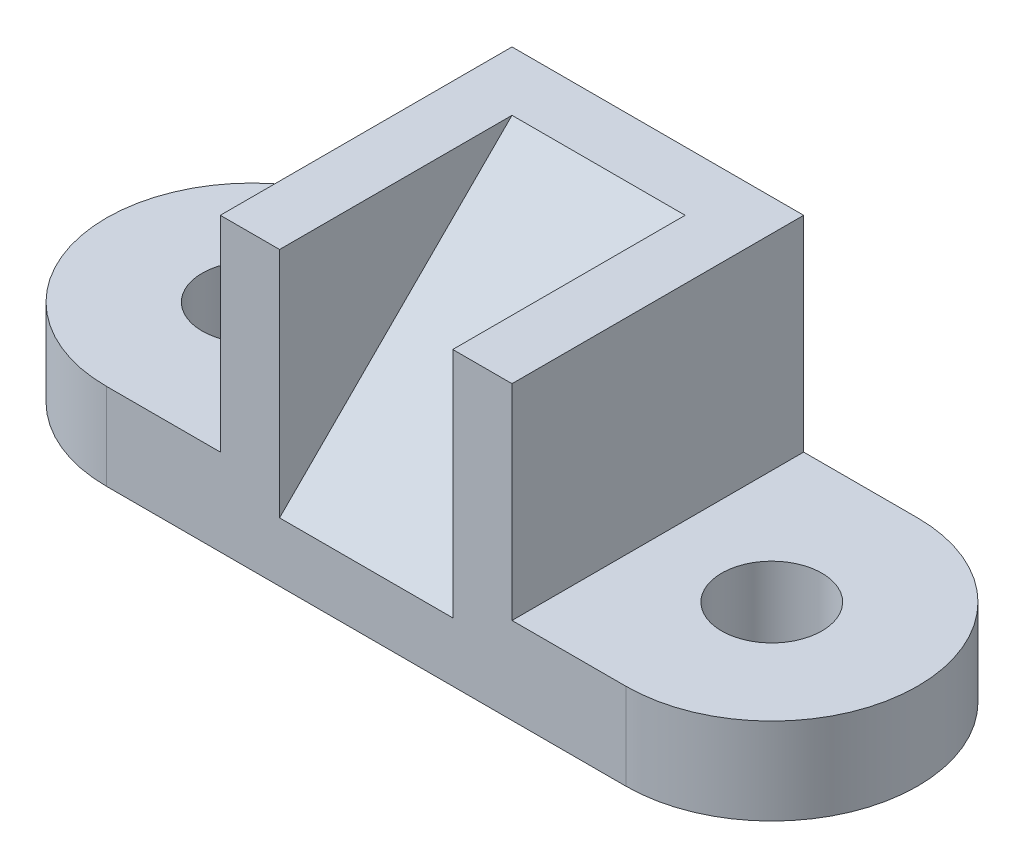
ISO-10303-21;
HEADER;
FILE_DESCRIPTION(('STEP AP214'),'2;1');
FILE_NAME('part.step','',(''),(''),'','','');
FILE_SCHEMA(('AUTOMOTIVE_DESIGN { 1 0 10303 214 1 1 1 1 }'));
ENDSEC;
DATA;
#1=APPLICATION_CONTEXT('core data for automotive mechanical design processes');
#2=APPLICATION_PROTOCOL_DEFINITION('international standard','automotive_design',2000,#1);
#3=PRODUCT_CONTEXT('',#1,'mechanical');
#4=PRODUCT('Part','Part','',(#3));
#5=PRODUCT_RELATED_PRODUCT_CATEGORY('part','',(#4));
#6=PRODUCT_DEFINITION_FORMATION('','',#4);
#7=PRODUCT_DEFINITION_CONTEXT('part definition',#1,'design');
#8=PRODUCT_DEFINITION('design','',#6,#7);
#9=PRODUCT_DEFINITION_SHAPE('','',#8);
#10=(LENGTH_UNIT() NAMED_UNIT(*) SI_UNIT(.MILLI.,.METRE.));
#11=(NAMED_UNIT(*) PLANE_ANGLE_UNIT() SI_UNIT($,.RADIAN.));
#12=(NAMED_UNIT(*) SI_UNIT($,.STERADIAN.) SOLID_ANGLE_UNIT());
#13=UNCERTAINTY_MEASURE_WITH_UNIT(LENGTH_MEASURE(1.E-05),#10,'distance_accuracy_value','');
#14=(GEOMETRIC_REPRESENTATION_CONTEXT(3) GLOBAL_UNCERTAINTY_ASSIGNED_CONTEXT((#13)) GLOBAL_UNIT_ASSIGNED_CONTEXT((#10,
#11,#12)) REPRESENTATION_CONTEXT('',''));
#15=CARTESIAN_POINT('',(0.,0.,0.));
#16=DIRECTION('',(0.,0.,1.));
#17=DIRECTION('',(1.,0.,0.));
#18=AXIS2_PLACEMENT_3D('',#15,#16,#17);
#19=CARTESIAN_POINT('',(19.,13.,32.));
#20=DIRECTION('',(1.,0.,0.));
#21=DIRECTION('',(0.,0.,-1.));
#22=AXIS2_PLACEMENT_3D('',#19,#20,#21);
#23=PLANE('',#22);
#24=DIRECTION('',(0.,-0.707106781186547,0.707106781186548));
#25=VECTOR('',#24,1.);
#26=CARTESIAN_POINT('',(19.,13.,32.));
#27=LINE('',#26,#25);
#28=CARTESIAN_POINT('',(19.,64.,-19.));
#29=VERTEX_POINT('',#28);
#30=CARTESIAN_POINT('',(19.,13.,32.));
#31=VERTEX_POINT('',#30);
#32=EDGE_CURVE('E134',#29,#31,#27,.T.);
#33=ORIENTED_EDGE('',*,*,#32,.T.);
#34=DIRECTION('',(0.,1.,0.));
#35=VECTOR('',#34,1.);
#36=CARTESIAN_POINT('',(19.,13.,32.));
#37=LINE('',#36,#35);
#38=CARTESIAN_POINT('',(19.,64.,32.));
#39=VERTEX_POINT('',#38);
#40=EDGE_CURVE('E123',#31,#39,#37,.T.);
#41=ORIENTED_EDGE('',*,*,#40,.T.);
#42=DIRECTION('',(0.,0.,-1.));
#43=VECTOR('',#42,1.);
#44=CARTESIAN_POINT('',(19.,64.,32.));
#45=LINE('',#44,#43);
#46=EDGE_CURVE('E54',#39,#29,#45,.T.);
#47=ORIENTED_EDGE('',*,*,#46,.T.);
#48=EDGE_LOOP('',(#33,#41,#47));
#49=FACE_BOUND('',#48,.T.);
#50=ADVANCED_FACE('F39',(#49),#23,.F.);
#51=CARTESIAN_POINT('',(-19.,13.,-19.));
#52=DIRECTION('',(-1.,0.,0.));
#53=DIRECTION('',(0.,0.,1.));
#54=AXIS2_PLACEMENT_3D('',#51,#52,#53);
#55=PLANE('',#54);
#56=DIRECTION('',(0.,-0.707106781186547,0.707106781186548));
#57=VECTOR('',#56,1.);
#58=CARTESIAN_POINT('',(-19.,13.,32.));
#59=LINE('',#58,#57);
#60=CARTESIAN_POINT('',(-19.,64.,-19.));
#61=VERTEX_POINT('',#60);
#62=CARTESIAN_POINT('',(-19.,13.,32.));
#63=VERTEX_POINT('',#62);
#64=EDGE_CURVE('E137',#61,#63,#59,.T.);
#65=ORIENTED_EDGE('',*,*,#64,.F.);
#66=DIRECTION('',(0.,0.,1.));
#67=VECTOR('',#66,1.);
#68=CARTESIAN_POINT('',(-19.,64.,-19.));
#69=LINE('',#68,#67);
#70=CARTESIAN_POINT('',(-19.,64.,32.));
#71=VERTEX_POINT('',#70);
#72=EDGE_CURVE('E140',#61,#71,#69,.T.);
#73=ORIENTED_EDGE('',*,*,#72,.T.);
#74=DIRECTION('',(0.,1.,0.));
#75=VECTOR('',#74,1.);
#76=CARTESIAN_POINT('',(-19.,13.,32.));
#77=LINE('',#76,#75);
#78=EDGE_CURVE('E131',#63,#71,#77,.T.);
#79=ORIENTED_EDGE('',*,*,#78,.F.);
#80=EDGE_LOOP('',(#65,#73,#79));
#81=FACE_BOUND('',#80,.T.);
#82=ADVANCED_FACE('F243',(#81),#55,.F.);
#83=CARTESIAN_POINT('',(57.,19.,0.));
#84=DIRECTION('',(0.,1.,0.));
#85=DIRECTION('',(0.,0.,1.));
#86=AXIS2_PLACEMENT_3D('',#83,#84,#85);
#87=PLANE('',#86);
#88=DIRECTION('',(0.,0.,-1.));
#89=VECTOR('',#88,1.);
#90=CARTESIAN_POINT('',(32.,19.,-32.));
#91=LINE('',#90,#89);
#92=CARTESIAN_POINT('',(32.,19.,32.));
#93=VERTEX_POINT('',#92);
#94=CARTESIAN_POINT('',(32.,19.,-32.));
#95=VERTEX_POINT('',#94);
#96=EDGE_CURVE('E62',#93,#95,#91,.T.);
#97=ORIENTED_EDGE('',*,*,#96,.F.);
#98=DIRECTION('',(1.,0.,0.));
#99=VECTOR('',#98,1.);
#100=CARTESIAN_POINT('',(-57.,19.,32.));
#101=LINE('',#100,#99);
#102=CARTESIAN_POINT('',(57.,19.,32.));
#103=VERTEX_POINT('',#102);
#104=EDGE_CURVE('E197',#93,#103,#101,.T.);
#105=ORIENTED_EDGE('',*,*,#104,.T.);
#106=CARTESIAN_POINT('',(57.,19.,0.));
#107=DIRECTION('',(0.,1.,0.));
#108=DIRECTION('',(0.,0.,1.));
#109=AXIS2_PLACEMENT_3D('',#106,#107,#108);
#110=CIRCLE('',#109,32.);
#111=CARTESIAN_POINT('',(57.,19.,-32.));
#112=VERTEX_POINT('',#111);
#113=EDGE_CURVE('E188',#103,#112,#110,.T.);
#114=ORIENTED_EDGE('',*,*,#113,.T.);
#115=DIRECTION('',(-1.,0.,0.));
#116=VECTOR('',#115,1.);
#117=CARTESIAN_POINT('',(-57.,19.,-32.));
#118=LINE('',#117,#116);
#119=EDGE_CURVE('E193',#112,#95,#118,.T.);
#120=ORIENTED_EDGE('',*,*,#119,.T.);
#121=EDGE_LOOP('',(#97,#105,#114,#120));
#122=FACE_BOUND('',#121,.T.);
#123=CARTESIAN_POINT('',(57.,19.,0.));
#124=DIRECTION('',(0.,1.,0.));
#125=DIRECTION('',(0.,0.,1.));
#126=AXIS2_PLACEMENT_3D('',#123,#124,#125);
#127=CIRCLE('',#126,11.);
#128=CARTESIAN_POINT('',(57.,19.,11.));
#129=VERTEX_POINT('',#128);
#130=EDGE_CURVE('E176',#129,#129,#127,.T.);
#131=ORIENTED_EDGE('',*,*,#130,.F.);
#132=EDGE_LOOP('',(#131));
#133=FACE_BOUND('',#132,.T.);
#134=ADVANCED_FACE('F231',(#122,#133),#87,.T.);
#135=DIRECTION('',(0.,0.,1.));
#136=VECTOR('',#135,1.);
#137=CARTESIAN_POINT('',(-32.,19.,-32.));
#138=LINE('',#137,#136);
#139=CARTESIAN_POINT('',(-32.,19.,-32.));
#140=VERTEX_POINT('',#139);
#141=CARTESIAN_POINT('',(-32.,19.,32.));
#142=VERTEX_POINT('',#141);
#143=EDGE_CURVE('E153',#140,#142,#138,.T.);
#144=ORIENTED_EDGE('',*,*,#143,.F.);
#145=CARTESIAN_POINT('',(-57.,19.,-32.));
#146=VERTEX_POINT('',#145);
#147=EDGE_CURVE('E191',#140,#146,#118,.T.);
#148=ORIENTED_EDGE('',*,*,#147,.T.);
#149=CARTESIAN_POINT('',(-57.,19.,0.));
#150=DIRECTION('',(0.,1.,0.));
#151=DIRECTION('',(0.,0.,1.));
#152=AXIS2_PLACEMENT_3D('',#149,#150,#151);
#153=CIRCLE('',#152,32.);
#154=CARTESIAN_POINT('',(-57.,19.,32.));
#155=VERTEX_POINT('',#154);
#156=EDGE_CURVE('E195',#146,#155,#153,.T.);
#157=ORIENTED_EDGE('',*,*,#156,.T.);
#158=EDGE_CURVE('E198',#155,#142,#101,.T.);
#159=ORIENTED_EDGE('',*,*,#158,.T.);
#160=EDGE_LOOP('',(#144,#148,#157,#159));
#161=FACE_BOUND('',#160,.T.);
#162=CARTESIAN_POINT('',(-57.,19.,0.));
#163=DIRECTION('',(0.,1.,0.));
#164=DIRECTION('',(0.,0.,1.));
#165=AXIS2_PLACEMENT_3D('',#162,#163,#164);
#166=CIRCLE('',#165,11.);
#167=CARTESIAN_POINT('',(-57.,19.,11.));
#168=VERTEX_POINT('',#167);
#169=EDGE_CURVE('E182',#168,#168,#166,.T.);
#170=ORIENTED_EDGE('',*,*,#169,.F.);
#171=EDGE_LOOP('',(#170));
#172=FACE_BOUND('',#171,.T.);
#173=ADVANCED_FACE('F249',(#161,#172),#87,.T.);
#174=CARTESIAN_POINT('',(57.,0.,0.));
#175=DIRECTION('',(0.,1.,0.));
#176=DIRECTION('',(0.,0.,1.));
#177=AXIS2_PLACEMENT_3D('',#174,#175,#176);
#178=PLANE('',#177);
#179=CARTESIAN_POINT('',(57.,0.,0.));
#180=DIRECTION('',(0.,1.,0.));
#181=DIRECTION('',(0.,0.,1.));
#182=AXIS2_PLACEMENT_3D('',#179,#180,#181);
#183=CIRCLE('',#182,32.);
#184=CARTESIAN_POINT('',(57.,0.,32.));
#185=VERTEX_POINT('',#184);
#186=CARTESIAN_POINT('',(57.,0.,-32.));
#187=VERTEX_POINT('',#186);
#188=EDGE_CURVE('E185',#185,#187,#183,.T.);
#189=ORIENTED_EDGE('',*,*,#188,.F.);
#190=DIRECTION('',(1.,0.,0.));
#191=VECTOR('',#190,1.);
#192=CARTESIAN_POINT('',(-57.,0.,32.));
#193=LINE('',#192,#191);
#194=CARTESIAN_POINT('',(-57.,0.,32.));
#195=VERTEX_POINT('',#194);
#196=EDGE_CURVE('E192',#195,#185,#193,.T.);
#197=ORIENTED_EDGE('',*,*,#196,.F.);
#198=CARTESIAN_POINT('',(-57.,0.,0.));
#199=DIRECTION('',(0.,1.,0.));
#200=DIRECTION('',(0.,0.,1.));
#201=AXIS2_PLACEMENT_3D('',#198,#199,#200);
#202=CIRCLE('',#201,32.);
#203=CARTESIAN_POINT('',(-57.,0.,-32.));
#204=VERTEX_POINT('',#203);
#205=EDGE_CURVE('E205',#204,#195,#202,.T.);
#206=ORIENTED_EDGE('',*,*,#205,.F.);
#207=DIRECTION('',(-1.,0.,0.));
#208=VECTOR('',#207,1.);
#209=CARTESIAN_POINT('',(-57.,0.,-32.));
#210=LINE('',#209,#208);
#211=EDGE_CURVE('E203',#187,#204,#210,.T.);
#212=ORIENTED_EDGE('',*,*,#211,.F.);
#213=EDGE_LOOP('',(#189,#197,#206,#212));
#214=FACE_BOUND('',#213,.T.);
#215=CARTESIAN_POINT('',(-57.,0.,0.));
#216=DIRECTION('',(0.,1.,0.));
#217=DIRECTION('',(0.,0.,1.));
#218=AXIS2_PLACEMENT_3D('',#215,#216,#217);
#219=CIRCLE('',#218,11.);
#220=CARTESIAN_POINT('',(-57.,0.,11.));
#221=VERTEX_POINT('',#220);
#222=EDGE_CURVE('E179',#221,#221,#219,.T.);
#223=ORIENTED_EDGE('',*,*,#222,.T.);
#224=EDGE_LOOP('',(#223));
#225=FACE_BOUND('',#224,.T.);
#226=CARTESIAN_POINT('',(57.,0.,0.));
#227=DIRECTION('',(0.,1.,0.));
#228=DIRECTION('',(0.,0.,1.));
#229=AXIS2_PLACEMENT_3D('',#226,#227,#228);
#230=CIRCLE('',#229,11.);
#231=CARTESIAN_POINT('',(57.,0.,11.));
#232=VERTEX_POINT('',#231);
#233=EDGE_CURVE('E175',#232,#232,#230,.T.);
#234=ORIENTED_EDGE('',*,*,#233,.T.);
#235=EDGE_LOOP('',(#234));
#236=FACE_BOUND('',#235,.T.);
#237=ADVANCED_FACE('F224',(#214,#225,#236),#178,.F.);
#238=CARTESIAN_POINT('',(57.,19.,0.));
#239=DIRECTION('',(0.,-1.,0.));
#240=DIRECTION('',(0.,0.,-1.));
#241=AXIS2_PLACEMENT_3D('',#238,#239,#240);
#242=CYLINDRICAL_SURFACE('',#241,32.);
#243=ORIENTED_EDGE('',*,*,#188,.T.);
#244=DIRECTION('',(0.,-1.,0.));
#245=VECTOR('',#244,1.);
#246=CARTESIAN_POINT('',(57.,19.,-32.));
#247=LINE('',#246,#245);
#248=EDGE_CURVE('E11',#112,#187,#247,.T.);
#249=ORIENTED_EDGE('',*,*,#248,.F.);
#250=ORIENTED_EDGE('',*,*,#113,.F.);
#251=DIRECTION('',(0.,-1.,0.));
#252=VECTOR('',#251,1.);
#253=CARTESIAN_POINT('',(57.,19.,32.));
#254=LINE('',#253,#252);
#255=EDGE_CURVE('E200',#103,#185,#254,.T.);
#256=ORIENTED_EDGE('',*,*,#255,.T.);
#257=EDGE_LOOP('',(#243,#249,#250,#256));
#258=FACE_BOUND('',#257,.T.);
#259=ADVANCED_FACE('F41',(#258),#242,.T.);
#260=CARTESIAN_POINT('',(-57.,19.,-32.));
#261=DIRECTION('',(0.,0.,1.));
#262=DIRECTION('',(1.,0.,0.));
#263=AXIS2_PLACEMENT_3D('',#260,#261,#262);
#264=PLANE('',#263);
#265=ORIENTED_EDGE('',*,*,#211,.T.);
#266=DIRECTION('',(0.,-1.,0.));
#267=VECTOR('',#266,1.);
#268=CARTESIAN_POINT('',(-57.,19.,-32.));
#269=LINE('',#268,#267);
#270=EDGE_CURVE('E47',#146,#204,#269,.T.);
#271=ORIENTED_EDGE('',*,*,#270,.F.);
#272=ORIENTED_EDGE('',*,*,#147,.F.);
#273=DIRECTION('',(0.,-1.,0.));
#274=VECTOR('',#273,1.);
#275=CARTESIAN_POINT('',(-32.,64.,-32.));
#276=LINE('',#275,#274);
#277=CARTESIAN_POINT('',(-32.,64.,-32.));
#278=VERTEX_POINT('',#277);
#279=EDGE_CURVE('E169',#278,#140,#276,.T.);
#280=ORIENTED_EDGE('',*,*,#279,.F.);
#281=DIRECTION('',(-1.,0.,0.));
#282=VECTOR('',#281,1.);
#283=CARTESIAN_POINT('',(-32.,64.,-32.));
#284=LINE('',#283,#282);
#285=CARTESIAN_POINT('',(32.,64.,-32.));
#286=VERTEX_POINT('',#285);
#287=EDGE_CURVE('E152',#286,#278,#284,.T.);
#288=ORIENTED_EDGE('',*,*,#287,.F.);
#289=DIRECTION('',(0.,-1.,0.));
#290=VECTOR('',#289,1.);
#291=CARTESIAN_POINT('',(32.,64.,-32.));
#292=LINE('',#291,#290);
#293=EDGE_CURVE('E172',#286,#95,#292,.T.);
#294=ORIENTED_EDGE('',*,*,#293,.T.);
#295=ORIENTED_EDGE('',*,*,#119,.F.);
#296=ORIENTED_EDGE('',*,*,#248,.T.);
#297=EDGE_LOOP('',(#265,#271,#272,#280,#288,#294,#295,#296));
#298=FACE_BOUND('',#297,.T.);
#299=ADVANCED_FACE('F251',(#298),#264,.F.);
#300=CARTESIAN_POINT('',(-57.,19.,0.));
#301=DIRECTION('',(0.,-1.,0.));
#302=DIRECTION('',(0.,0.,-1.));
#303=AXIS2_PLACEMENT_3D('',#300,#301,#302);
#304=CYLINDRICAL_SURFACE('',#303,32.);
#305=ORIENTED_EDGE('',*,*,#205,.T.);
#306=DIRECTION('',(0.,-1.,0.));
#307=VECTOR('',#306,1.);
#308=CARTESIAN_POINT('',(-57.,19.,32.));
#309=LINE('',#308,#307);
#310=EDGE_CURVE('E210',#155,#195,#309,.T.);
#311=ORIENTED_EDGE('',*,*,#310,.F.);
#312=ORIENTED_EDGE('',*,*,#156,.F.);
#313=ORIENTED_EDGE('',*,*,#270,.T.);
#314=EDGE_LOOP('',(#305,#311,#312,#313));
#315=FACE_BOUND('',#314,.T.);
#316=ADVANCED_FACE('F217',(#315),#304,.T.);
#317=CARTESIAN_POINT('',(-57.,19.,32.));
#318=DIRECTION('',(0.,0.,-1.));
#319=DIRECTION('',(-1.,0.,0.));
#320=AXIS2_PLACEMENT_3D('',#317,#318,#319);
#321=PLANE('',#320);
#322=DIRECTION('',(1.,0.,0.));
#323=VECTOR('',#322,1.);
#324=CARTESIAN_POINT('',(-32.,64.,32.));
#325=LINE('',#324,#323);
#326=CARTESIAN_POINT('',(32.,64.,32.));
#327=VERTEX_POINT('',#326);
#328=EDGE_CURVE('E130',#39,#327,#325,.T.);
#329=ORIENTED_EDGE('',*,*,#328,.F.);
#330=ORIENTED_EDGE('',*,*,#40,.F.);
#331=DIRECTION('',(1.,0.,0.));
#332=VECTOR('',#331,1.);
#333=CARTESIAN_POINT('',(19.,13.,32.));
#334=LINE('',#333,#332);
#335=EDGE_CURVE('E127',#63,#31,#334,.T.);
#336=ORIENTED_EDGE('',*,*,#335,.F.);
#337=ORIENTED_EDGE('',*,*,#78,.T.);
#338=CARTESIAN_POINT('',(-32.,64.,32.));
#339=VERTEX_POINT('',#338);
#340=EDGE_CURVE('E157',#339,#71,#325,.T.);
#341=ORIENTED_EDGE('',*,*,#340,.F.);
#342=DIRECTION('',(0.,-1.,0.));
#343=VECTOR('',#342,1.);
#344=CARTESIAN_POINT('',(-32.,64.,32.));
#345=LINE('',#344,#343);
#346=EDGE_CURVE('E166',#339,#142,#345,.T.);
#347=ORIENTED_EDGE('',*,*,#346,.T.);
#348=ORIENTED_EDGE('',*,*,#158,.F.);
#349=ORIENTED_EDGE('',*,*,#310,.T.);
#350=ORIENTED_EDGE('',*,*,#196,.T.);
#351=ORIENTED_EDGE('',*,*,#255,.F.);
#352=ORIENTED_EDGE('',*,*,#104,.F.);
#353=DIRECTION('',(0.,-1.,0.));
#354=VECTOR('',#353,1.);
#355=CARTESIAN_POINT('',(32.,64.,32.));
#356=LINE('',#355,#354);
#357=EDGE_CURVE('E160',#327,#93,#356,.T.);
#358=ORIENTED_EDGE('',*,*,#357,.F.);
#359=EDGE_LOOP('',(#329,#330,#336,#337,#341,#347,#348,#349,#350,#351,#352,#358));
#360=FACE_BOUND('',#359,.T.);
#361=ADVANCED_FACE('F124',(#360),#321,.F.);
#362=CARTESIAN_POINT('',(-57.,19.,0.));
#363=DIRECTION('',(0.,-1.,0.));
#364=DIRECTION('',(0.,0.,-1.));
#365=AXIS2_PLACEMENT_3D('',#362,#363,#364);
#366=CYLINDRICAL_SURFACE('',#365,11.);
#367=ORIENTED_EDGE('',*,*,#169,.T.);
#368=EDGE_LOOP('',(#367));
#369=FACE_BOUND('',#368,.T.);
#370=ORIENTED_EDGE('',*,*,#222,.F.);
#371=EDGE_LOOP('',(#370));
#372=FACE_BOUND('',#371,.T.);
#373=ADVANCED_FACE('F276',(#369,#372),#366,.F.);
#374=CARTESIAN_POINT('',(57.,19.,0.));
#375=DIRECTION('',(0.,-1.,0.));
#376=DIRECTION('',(0.,0.,-1.));
#377=AXIS2_PLACEMENT_3D('',#374,#375,#376);
#378=CYLINDRICAL_SURFACE('',#377,11.);
#379=ORIENTED_EDGE('',*,*,#130,.T.);
#380=EDGE_LOOP('',(#379));
#381=FACE_BOUND('',#380,.T.);
#382=ORIENTED_EDGE('',*,*,#233,.F.);
#383=EDGE_LOOP('',(#382));
#384=FACE_BOUND('',#383,.T.);
#385=ADVANCED_FACE('F273',(#381,#384),#378,.F.);
#386=CARTESIAN_POINT('',(32.,64.,-32.));
#387=DIRECTION('',(-1.,0.,0.));
#388=DIRECTION('',(0.,0.,1.));
#389=AXIS2_PLACEMENT_3D('',#386,#387,#388);
#390=PLANE('',#389);
#391=ORIENTED_EDGE('',*,*,#96,.T.);
#392=ORIENTED_EDGE('',*,*,#293,.F.);
#393=DIRECTION('',(0.,0.,-1.));
#394=VECTOR('',#393,1.);
#395=CARTESIAN_POINT('',(32.,64.,-32.));
#396=LINE('',#395,#394);
#397=EDGE_CURVE('E149',#327,#286,#396,.T.);
#398=ORIENTED_EDGE('',*,*,#397,.F.);
#399=ORIENTED_EDGE('',*,*,#357,.T.);
#400=EDGE_LOOP('',(#391,#392,#398,#399));
#401=FACE_BOUND('',#400,.T.);
#402=ADVANCED_FACE('F235',(#401),#390,.F.);
#403=CARTESIAN_POINT('',(-32.,64.,-32.));
#404=DIRECTION('',(1.,0.,0.));
#405=DIRECTION('',(0.,0.,-1.));
#406=AXIS2_PLACEMENT_3D('',#403,#404,#405);
#407=PLANE('',#406);
#408=ORIENTED_EDGE('',*,*,#143,.T.);
#409=ORIENTED_EDGE('',*,*,#346,.F.);
#410=DIRECTION('',(0.,0.,1.));
#411=VECTOR('',#410,1.);
#412=CARTESIAN_POINT('',(-32.,64.,-32.));
#413=LINE('',#412,#411);
#414=EDGE_CURVE('E155',#278,#339,#413,.T.);
#415=ORIENTED_EDGE('',*,*,#414,.F.);
#416=ORIENTED_EDGE('',*,*,#279,.T.);
#417=EDGE_LOOP('',(#408,#409,#415,#416));
#418=FACE_BOUND('',#417,.T.);
#419=ADVANCED_FACE('F247',(#418),#407,.F.);
#420=CARTESIAN_POINT('',(0.,64.,0.));
#421=DIRECTION('',(0.,1.,0.));
#422=DIRECTION('',(0.,0.,1.));
#423=AXIS2_PLACEMENT_3D('',#420,#421,#422);
#424=PLANE('',#423);
#425=ORIENTED_EDGE('',*,*,#46,.F.);
#426=ORIENTED_EDGE('',*,*,#328,.T.);
#427=ORIENTED_EDGE('',*,*,#397,.T.);
#428=ORIENTED_EDGE('',*,*,#287,.T.);
#429=ORIENTED_EDGE('',*,*,#414,.T.);
#430=ORIENTED_EDGE('',*,*,#340,.T.);
#431=ORIENTED_EDGE('',*,*,#72,.F.);
#432=DIRECTION('',(-1.,0.,0.));
#433=VECTOR('',#432,1.);
#434=CARTESIAN_POINT('',(19.,64.,-19.));
#435=LINE('',#434,#433);
#436=EDGE_CURVE('E143',#29,#61,#435,.T.);
#437=ORIENTED_EDGE('',*,*,#436,.F.);
#438=EDGE_LOOP('',(#425,#426,#427,#428,#429,#430,#431,#437));
#439=FACE_BOUND('',#438,.T.);
#440=ADVANCED_FACE('F238',(#439),#424,.T.);
#441=CARTESIAN_POINT('',(91.1248916810278,13.,32.));
#442=DIRECTION('',(0.,-0.707106781186548,-0.707106781186547));
#443=DIRECTION('',(0.,0.707106781186547,-0.707106781186548));
#444=AXIS2_PLACEMENT_3D('',#441,#442,#443);
#445=PLANE('',#444);
#446=ORIENTED_EDGE('',*,*,#32,.F.);
#447=ORIENTED_EDGE('',*,*,#436,.T.);
#448=ORIENTED_EDGE('',*,*,#64,.T.);
#449=ORIENTED_EDGE('',*,*,#335,.T.);
#450=EDGE_LOOP('',(#446,#447,#448,#449));
#451=FACE_BOUND('',#450,.T.);
#452=ADVANCED_FACE('F139',(#451),#445,.F.);
#453=CLOSED_SHELL('',(#50,#82,#134,#173,#237,#259,#299,#316,#361,#373,#385,#402,#419,#440,#452));
#454=MANIFOLD_SOLID_BREP('B2',#453);
#455=ADVANCED_BREP_SHAPE_REPRESENTATION('',(#18,#454),#14);
#456=SHAPE_DEFINITION_REPRESENTATION(#9,#455);
ENDSEC;
END-ISO-10303-21;
